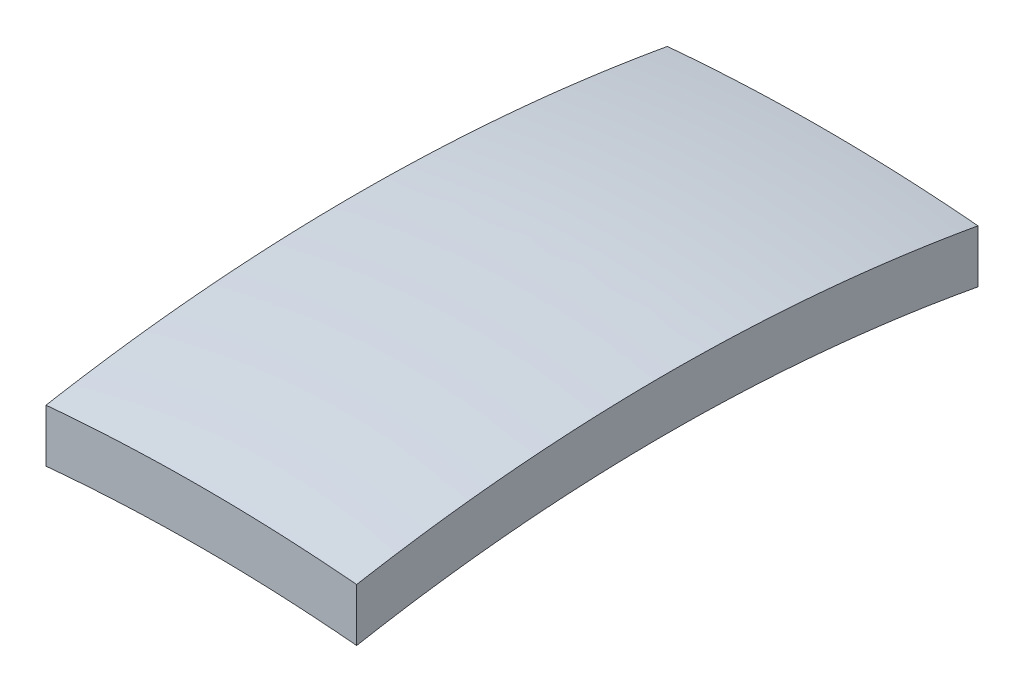
ISO-10303-21;
HEADER;
FILE_DESCRIPTION(('STEP AP214'),'2;1');
FILE_NAME('part.step','',(''),(''),'','','');
FILE_SCHEMA(('AUTOMOTIVE_DESIGN { 1 0 10303 214 1 1 1 1 }'));
ENDSEC;
DATA;
#1=APPLICATION_CONTEXT('core data for automotive mechanical design processes');
#2=APPLICATION_PROTOCOL_DEFINITION('international standard','automotive_design',2000,#1);
#3=PRODUCT_CONTEXT('',#1,'mechanical');
#4=PRODUCT('Part','Part','',(#3));
#5=PRODUCT_RELATED_PRODUCT_CATEGORY('part','',(#4));
#6=PRODUCT_DEFINITION_FORMATION('','',#4);
#7=PRODUCT_DEFINITION_CONTEXT('part definition',#1,'design');
#8=PRODUCT_DEFINITION('design','',#6,#7);
#9=PRODUCT_DEFINITION_SHAPE('','',#8);
#10=(LENGTH_UNIT() NAMED_UNIT(*) SI_UNIT(.MILLI.,.METRE.));
#11=(NAMED_UNIT(*) PLANE_ANGLE_UNIT() SI_UNIT($,.RADIAN.));
#12=(NAMED_UNIT(*) SI_UNIT($,.STERADIAN.) SOLID_ANGLE_UNIT());
#13=UNCERTAINTY_MEASURE_WITH_UNIT(LENGTH_MEASURE(1.E-05),#10,'distance_accuracy_value','');
#14=(GEOMETRIC_REPRESENTATION_CONTEXT(3) GLOBAL_UNCERTAINTY_ASSIGNED_CONTEXT((#13)) GLOBAL_UNIT_ASSIGNED_CONTEXT((#10,
#11,#12)) REPRESENTATION_CONTEXT('',''));
#15=CARTESIAN_POINT('',(0.,0.,0.));
#16=DIRECTION('',(0.,0.,1.));
#17=DIRECTION('',(1.,0.,0.));
#18=AXIS2_PLACEMENT_3D('',#15,#16,#17);
#19=CARTESIAN_POINT('',(0.,0.,0.));
#20=DIRECTION('',(0.,1.,0.));
#21=DIRECTION('',(0.,0.,1.));
#22=AXIS2_PLACEMENT_3D('',#19,#20,#21);
#23=SPHERICAL_SURFACE('',#22,332.);
#24=CARTESIAN_POINT('',(0.,0.,60.));
#25=DIRECTION('',(0.,0.,1.));
#26=DIRECTION('',(1.,0.,0.));
#27=AXIS2_PLACEMENT_3D('',#24,#25,#26);
#28=CIRCLE('',#27,326.533306111337);
#29=CARTESIAN_POINT('',(30.,325.152272020357,60.));
#30=VERTEX_POINT('',#29);
#31=CARTESIAN_POINT('',(-30.,325.152272020357,60.));
#32=VERTEX_POINT('',#31);
#33=EDGE_CURVE('E45',#30,#32,#28,.T.);
#34=ORIENTED_EDGE('',*,*,#33,.T.);
#35=CARTESIAN_POINT('',(-30.,0.,0.));
#36=DIRECTION('',(-1.,0.,0.));
#37=DIRECTION('',(0.,0.,1.));
#38=AXIS2_PLACEMENT_3D('',#35,#36,#37);
#39=CIRCLE('',#38,330.641800140273);
#40=CARTESIAN_POINT('',(-30.,325.152272020357,-60.));
#41=VERTEX_POINT('',#40);
#42=EDGE_CURVE('E86',#32,#41,#39,.T.);
#43=ORIENTED_EDGE('',*,*,#42,.T.);
#44=CARTESIAN_POINT('',(0.,0.,-60.));
#45=DIRECTION('',(0.,0.,-1.));
#46=DIRECTION('',(-1.,0.,0.));
#47=AXIS2_PLACEMENT_3D('',#44,#45,#46);
#48=CIRCLE('',#47,326.533306111337);
#49=CARTESIAN_POINT('',(30.,325.152272020357,-60.));
#50=VERTEX_POINT('',#49);
#51=EDGE_CURVE('E77',#41,#50,#48,.T.);
#52=ORIENTED_EDGE('',*,*,#51,.T.);
#53=CARTESIAN_POINT('',(30.,0.,0.));
#54=DIRECTION('',(1.,0.,0.));
#55=DIRECTION('',(0.,0.,-1.));
#56=AXIS2_PLACEMENT_3D('',#53,#54,#55);
#57=CIRCLE('',#56,330.641800140273);
#58=EDGE_CURVE('E85',#50,#30,#57,.T.);
#59=ORIENTED_EDGE('',*,*,#58,.T.);
#60=EDGE_LOOP('',(#34,#43,#52,#59));
#61=FACE_BOUND('',#60,.T.);
#62=ADVANCED_FACE('F37',(#61),#23,.F.);
#63=CARTESIAN_POINT('',(-30.,342.001,60.));
#64=DIRECTION('',(0.,0.,1.));
#65=DIRECTION('',(1.,0.,0.));
#66=AXIS2_PLACEMENT_3D('',#63,#64,#65);
#67=PLANE('',#66);
#68=DIRECTION('',(0.,-1.,0.));
#69=VECTOR('',#68,1.);
#70=CARTESIAN_POINT('',(-30.,342.001,60.));
#71=LINE('',#70,#69);
#72=CARTESIAN_POINT('',(-30.,335.356526699571,60.));
#73=VERTEX_POINT('',#72);
#74=EDGE_CURVE('E94',#73,#32,#71,.T.);
#75=ORIENTED_EDGE('',*,*,#74,.T.);
#76=ORIENTED_EDGE('',*,*,#33,.F.);
#77=DIRECTION('',(0.,-1.,0.));
#78=VECTOR('',#77,1.);
#79=CARTESIAN_POINT('',(30.,342.001,60.));
#80=LINE('',#79,#78);
#81=CARTESIAN_POINT('',(30.,335.356526699571,60.));
#82=VERTEX_POINT('',#81);
#83=EDGE_CURVE('E57',#82,#30,#80,.T.);
#84=ORIENTED_EDGE('',*,*,#83,.F.);
#85=CARTESIAN_POINT('',(0.,0.,60.));
#86=DIRECTION('',(0.,0.,1.));
#87=DIRECTION('',(1.,0.,0.));
#88=AXIS2_PLACEMENT_3D('',#85,#86,#87);
#89=CIRCLE('',#88,336.695708318357);
#90=EDGE_CURVE('E11',#73,#82,#89,.F.);
#91=ORIENTED_EDGE('',*,*,#90,.F.);
#92=EDGE_LOOP('',(#75,#76,#84,#91));
#93=FACE_BOUND('',#92,.T.);
#94=ADVANCED_FACE('F109',(#93),#67,.T.);
#95=CARTESIAN_POINT('',(-30.,342.001,-60.));
#96=DIRECTION('',(-1.,0.,0.));
#97=DIRECTION('',(0.,0.,1.));
#98=AXIS2_PLACEMENT_3D('',#95,#96,#97);
#99=PLANE('',#98);
#100=DIRECTION('',(0.,-1.,0.));
#101=VECTOR('',#100,1.);
#102=CARTESIAN_POINT('',(-30.,342.001,-60.));
#103=LINE('',#102,#101);
#104=CARTESIAN_POINT('',(-30.,335.356526699571,-60.));
#105=VERTEX_POINT('',#104);
#106=EDGE_CURVE('E80',#105,#41,#103,.T.);
#107=ORIENTED_EDGE('',*,*,#106,.T.);
#108=ORIENTED_EDGE('',*,*,#42,.F.);
#109=ORIENTED_EDGE('',*,*,#74,.F.);
#110=CARTESIAN_POINT('',(-30.,0.,0.));
#111=DIRECTION('',(-1.,0.,0.));
#112=DIRECTION('',(0.,0.,1.));
#113=AXIS2_PLACEMENT_3D('',#110,#111,#112);
#114=CIRCLE('',#113,340.681669597881);
#115=EDGE_CURVE('E93',#105,#73,#114,.F.);
#116=ORIENTED_EDGE('',*,*,#115,.F.);
#117=EDGE_LOOP('',(#107,#108,#109,#116));
#118=FACE_BOUND('',#117,.T.);
#119=ADVANCED_FACE('F89',(#118),#99,.T.);
#120=CARTESIAN_POINT('',(-30.,342.001,-60.));
#121=DIRECTION('',(0.,0.,-1.));
#122=DIRECTION('',(-1.,0.,0.));
#123=AXIS2_PLACEMENT_3D('',#120,#121,#122);
#124=PLANE('',#123);
#125=DIRECTION('',(0.,-1.,0.));
#126=VECTOR('',#125,1.);
#127=CARTESIAN_POINT('',(30.,342.001,-60.));
#128=LINE('',#127,#126);
#129=CARTESIAN_POINT('',(30.,335.356526699571,-60.));
#130=VERTEX_POINT('',#129);
#131=EDGE_CURVE('E52',#130,#50,#128,.T.);
#132=ORIENTED_EDGE('',*,*,#131,.T.);
#133=ORIENTED_EDGE('',*,*,#51,.F.);
#134=ORIENTED_EDGE('',*,*,#106,.F.);
#135=CARTESIAN_POINT('',(0.,0.,-60.));
#136=DIRECTION('',(0.,0.,-1.));
#137=DIRECTION('',(-1.,0.,0.));
#138=AXIS2_PLACEMENT_3D('',#135,#136,#137);
#139=CIRCLE('',#138,336.695708318357);
#140=EDGE_CURVE('E101',#130,#105,#139,.F.);
#141=ORIENTED_EDGE('',*,*,#140,.F.);
#142=EDGE_LOOP('',(#132,#133,#134,#141));
#143=FACE_BOUND('',#142,.T.);
#144=ADVANCED_FACE('F79',(#143),#124,.T.);
#145=CARTESIAN_POINT('',(30.,342.001,-60.));
#146=DIRECTION('',(1.,0.,0.));
#147=DIRECTION('',(0.,0.,-1.));
#148=AXIS2_PLACEMENT_3D('',#145,#146,#147);
#149=PLANE('',#148);
#150=ORIENTED_EDGE('',*,*,#83,.T.);
#151=ORIENTED_EDGE('',*,*,#58,.F.);
#152=ORIENTED_EDGE('',*,*,#131,.F.);
#153=CARTESIAN_POINT('',(30.,0.,0.));
#154=DIRECTION('',(1.,0.,0.));
#155=DIRECTION('',(0.,0.,-1.));
#156=AXIS2_PLACEMENT_3D('',#153,#154,#155);
#157=CIRCLE('',#156,340.681669597881);
#158=EDGE_CURVE('E103',#82,#130,#157,.F.);
#159=ORIENTED_EDGE('',*,*,#158,.F.);
#160=EDGE_LOOP('',(#150,#151,#152,#159));
#161=FACE_BOUND('',#160,.T.);
#162=ADVANCED_FACE('F111',(#161),#149,.T.);
#163=CARTESIAN_POINT('',(0.,0.,0.));
#164=DIRECTION('',(0.,1.,0.));
#165=DIRECTION('',(0.,0.,-1.));
#166=AXIS2_PLACEMENT_3D('',#163,#164,#165);
#167=SPHERICAL_SURFACE('',#166,342.);
#168=ORIENTED_EDGE('',*,*,#90,.T.);
#169=ORIENTED_EDGE('',*,*,#158,.T.);
#170=ORIENTED_EDGE('',*,*,#140,.T.);
#171=ORIENTED_EDGE('',*,*,#115,.T.);
#172=EDGE_LOOP('',(#168,#169,#170,#171));
#173=FACE_BOUND('',#172,.T.);
#174=ADVANCED_FACE('F39',(#173),#167,.T.);
#175=CLOSED_SHELL('',(#62,#94,#119,#144,#162,#174));
#176=MANIFOLD_SOLID_BREP('B2',#175);
#177=ADVANCED_BREP_SHAPE_REPRESENTATION('',(#18,#176),#14);
#178=SHAPE_DEFINITION_REPRESENTATION(#9,#177);
ENDSEC;
END-ISO-10303-21;
